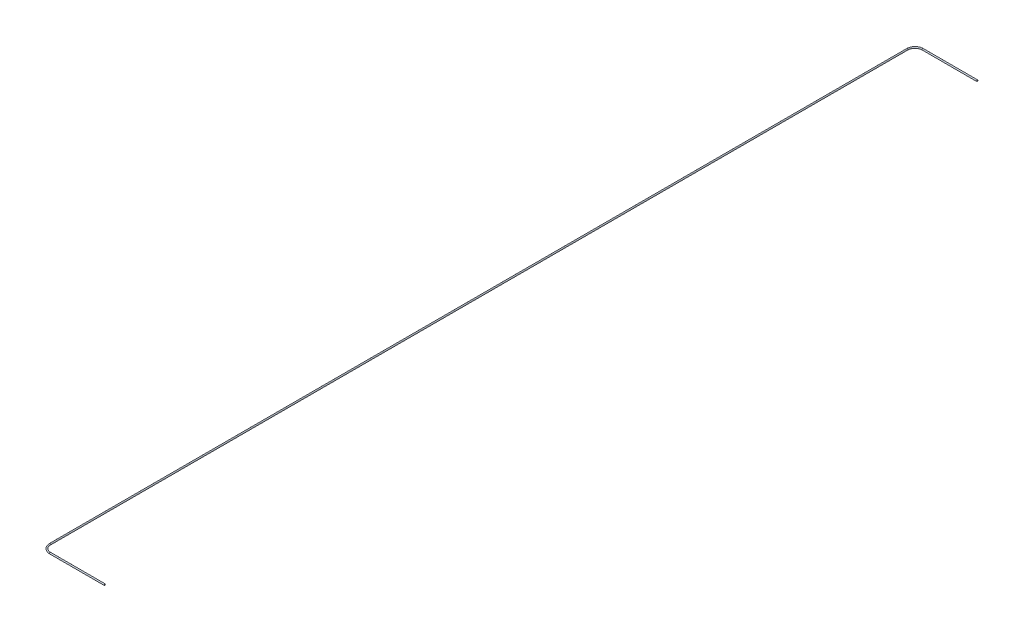
ISO-10303-21;
HEADER;
FILE_DESCRIPTION(('STEP AP214'),'2;1');
FILE_NAME('part.step','',(''),(''),'','','');
FILE_SCHEMA(('AUTOMOTIVE_DESIGN { 1 0 10303 214 1 1 1 1 }'));
ENDSEC;
DATA;
#1=APPLICATION_CONTEXT('core data for automotive mechanical design processes');
#2=APPLICATION_PROTOCOL_DEFINITION('international standard','automotive_design',2000,#1);
#3=PRODUCT_CONTEXT('',#1,'mechanical');
#4=PRODUCT('Part','Part','',(#3));
#5=PRODUCT_RELATED_PRODUCT_CATEGORY('part','',(#4));
#6=PRODUCT_DEFINITION_FORMATION('','',#4);
#7=PRODUCT_DEFINITION_CONTEXT('part definition',#1,'design');
#8=PRODUCT_DEFINITION('design','',#6,#7);
#9=PRODUCT_DEFINITION_SHAPE('','',#8);
#10=(LENGTH_UNIT() NAMED_UNIT(*) SI_UNIT(.MILLI.,.METRE.));
#11=(NAMED_UNIT(*) PLANE_ANGLE_UNIT() SI_UNIT($,.RADIAN.));
#12=(NAMED_UNIT(*) SI_UNIT($,.STERADIAN.) SOLID_ANGLE_UNIT());
#13=UNCERTAINTY_MEASURE_WITH_UNIT(LENGTH_MEASURE(1.E-05),#10,'distance_accuracy_value','');
#14=(GEOMETRIC_REPRESENTATION_CONTEXT(3) GLOBAL_UNCERTAINTY_ASSIGNED_CONTEXT((#13)) GLOBAL_UNIT_ASSIGNED_CONTEXT((#10,
#11,#12)) REPRESENTATION_CONTEXT('',''));
#15=CARTESIAN_POINT('',(0.,0.,0.));
#16=DIRECTION('',(0.,0.,1.));
#17=DIRECTION('',(1.,0.,0.));
#18=AXIS2_PLACEMENT_3D('',#15,#16,#17);
#19=CARTESIAN_POINT('',(599.999999999967,-1.87849735766576E-10,-4199.99999999948));
#20=DIRECTION('',(0.999999999999962,0.,0.));
#21=DIRECTION('',(0.,0.,-0.999999999999893));
#22=AXIS2_PLACEMENT_3D('',#19,#20,#21);
#23=PLANE('',#22);
#24=CARTESIAN_POINT('',(599.999999999967,-1.87849735766576E-10,-4199.99999999948));
#25=DIRECTION('',(0.999999999999962,0.,0.));
#26=DIRECTION('',(0.,0.,-0.999999999999893));
#27=AXIS2_PLACEMENT_3D('',#24,#25,#26);
#28=CIRCLE('',#27,6.3500000000003);
#29=CARTESIAN_POINT('',(599.999999999967,-1.88107410203919E-10,-4206.34999999948));
#30=VERTEX_POINT('',#29);
#31=EDGE_CURVE('E77',#30,#30,#28,.T.);
#32=ORIENTED_EDGE('',*,*,#31,.T.);
#33=EDGE_LOOP('',(#32));
#34=FACE_BOUND('',#33,.T.);
#35=ADVANCED_FACE('F48',(#34),#23,.T.);
#36=CARTESIAN_POINT('',(599.999999999932,1.97619698383278E-10,4199.99999999951));
#37=DIRECTION('',(-0.999999999999962,0.,0.));
#38=DIRECTION('',(0.,0.,0.999999999999893));
#39=AXIS2_PLACEMENT_3D('',#36,#37,#38);
#40=PLANE('',#39);
#41=CARTESIAN_POINT('',(599.999999999932,1.97619698383278E-10,4199.99999999951));
#42=DIRECTION('',(-0.999999999999962,0.,0.));
#43=DIRECTION('',(0.,0.,0.999999999999893));
#44=AXIS2_PLACEMENT_3D('',#41,#42,#43);
#45=CIRCLE('',#44,6.3500000000003);
#46=CARTESIAN_POINT('',(599.999999999932,1.97877372820621E-10,4206.3499999995));
#47=VERTEX_POINT('',#46);
#48=EDGE_CURVE('E11',#47,#47,#45,.T.);
#49=ORIENTED_EDGE('',*,*,#48,.F.);
#50=EDGE_LOOP('',(#49));
#51=FACE_BOUND('',#50,.T.);
#52=ADVANCED_FACE('F87',(#51),#40,.F.);
#53=CARTESIAN_POINT('',(599.999999999967,-1.87849735766576E-10,-4199.99999999948));
#54=DIRECTION('',(-0.999999999999962,0.,0.));
#55=DIRECTION('',(0.,0.,0.999999999999893));
#56=AXIS2_PLACEMENT_3D('',#53,#54,#55);
#57=CYLINDRICAL_SURFACE('',#56,6.3500000000003);
#58=CARTESIAN_POINT('',(74.9999999999851,-1.78523862359725E-10,-4199.99999999949));
#59=DIRECTION('',(0.999999999999962,0.,0.));
#60=DIRECTION('',(0.,0.,-0.999999999999893));
#61=AXIS2_PLACEMENT_3D('',#58,#59,#60);
#62=CIRCLE('',#61,6.3500000000003);
#63=CARTESIAN_POINT('',(74.9999999999859,-1.78711860125229E-10,-4206.34999999951));
#64=VERTEX_POINT('',#63);
#65=EDGE_CURVE('E73',#64,#64,#62,.T.);
#66=ORIENTED_EDGE('',*,*,#65,.T.);
#67=EDGE_LOOP('',(#66));
#68=FACE_BOUND('',#67,.T.);
#69=ORIENTED_EDGE('',*,*,#31,.F.);
#70=EDGE_LOOP('',(#69));
#71=FACE_BOUND('',#70,.T.);
#72=ADVANCED_FACE('F84',(#68,#71),#57,.T.);
#73=CARTESIAN_POINT('',(74.9999999999753,-1.76303416310475E-10,-4124.99999999951));
#74=DIRECTION('',(0.,1.00000000000002,0.));
#75=DIRECTION('',(0.,0.,0.999999999999893));
#76=AXIS2_PLACEMENT_3D('',#73,#74,#75);
#77=TOROIDAL_SURFACE('',#76,75.0000000000002,6.3500000000003);
#78=CARTESIAN_POINT('',(-1.86517468137026E-11,-1.73194791841524E-10,-4124.99999999951));
#79=DIRECTION('',(0.,0.,-0.999999999999893));
#80=DIRECTION('',(-0.999999999999962,0.,0.));
#81=AXIS2_PLACEMENT_3D('',#78,#79,#80);
#82=CIRCLE('',#81,6.3500000000003);
#83=CARTESIAN_POINT('',(-6.35000000002517,-1.7293159496982E-10,-4124.99999999951));
#84=VERTEX_POINT('',#83);
#85=EDGE_CURVE('E67',#84,#84,#82,.T.);
#86=CARTESIAN_POINT('',(74.9999999999753,-1.76303416310475E-10,-4124.99999999951));
#87=DIRECTION('',(0.,1.00000000000002,0.));
#88=DIRECTION('',(0.,0.,0.999999999999893));
#89=AXIS2_PLACEMENT_3D('',#86,#87,#88);
#90=CIRCLE('',#89,81.3500000000005);
#91=EDGE_CURVE('',#64,#84,#90,.T.);
#92=ORIENTED_EDGE('',*,*,#65,.F.);
#93=ORIENTED_EDGE('',*,*,#85,.T.);
#94=ORIENTED_EDGE('',*,*,#91,.T.);
#95=ORIENTED_EDGE('',*,*,#91,.F.);
#96=EDGE_LOOP('',(#92,#94,#93,#95));
#97=FACE_BOUND('',#96,.T.);
#98=ADVANCED_FACE('F86',(#97),#77,.T.);
#99=CARTESIAN_POINT('',(-1.86517468137026E-11,-1.73194791841524E-10,-4124.99999999951));
#100=DIRECTION('',(0.,0.,0.999999999999898));
#101=DIRECTION('',(0.99999999999994,0.,0.));
#102=AXIS2_PLACEMENT_3D('',#99,#100,#101);
#103=CYLINDRICAL_SURFACE('',#102,6.3500000000003);
#104=CARTESIAN_POINT('',(-3.81916720471054E-11,1.99840144432528E-10,4124.99999999952));
#105=DIRECTION('',(0.,0.,-0.999999999999898));
#106=DIRECTION('',(-0.99999999999994,0.,0.));
#107=AXIS2_PLACEMENT_3D('',#104,#105,#106);
#108=CIRCLE('',#107,6.3500000000003);
#109=CARTESIAN_POINT('',(-6.35000000002511,1.99689746220126E-10,4124.99999999952));
#110=VERTEX_POINT('',#109);
#111=EDGE_CURVE('E61',#110,#110,#108,.T.);
#112=ORIENTED_EDGE('',*,*,#111,.T.);
#113=EDGE_LOOP('',(#112));
#114=FACE_BOUND('',#113,.T.);
#115=ORIENTED_EDGE('',*,*,#85,.F.);
#116=EDGE_LOOP('',(#115));
#117=FACE_BOUND('',#116,.T.);
#118=ADVANCED_FACE('F94',(#114,#117),#103,.T.);
#119=CARTESIAN_POINT('',(74.9999999999762,2.01616501271928E-10,4124.9999999995));
#120=DIRECTION('',(0.,1.00000000000002,0.));
#121=DIRECTION('',(0.,0.,0.999999999999893));
#122=AXIS2_PLACEMENT_3D('',#119,#120,#121);
#123=TOROIDAL_SURFACE('',#122,75.000000000001,6.3500000000003);
#124=CARTESIAN_POINT('',(74.9999999999691,2.1049828546893E-10,4199.99999999951));
#125=DIRECTION('',(-0.999999999999962,0.,0.));
#126=DIRECTION('',(0.,0.,0.999999999999893));
#127=AXIS2_PLACEMENT_3D('',#124,#125,#126);
#128=CIRCLE('',#127,6.3500000000003);
#129=CARTESIAN_POINT('',(74.9999999999685,2.11250276530942E-10,4206.3499999995));
#130=VERTEX_POINT('',#129);
#131=EDGE_CURVE('E55',#130,#130,#128,.T.);
#132=CARTESIAN_POINT('',(74.9999999999762,2.01616501271928E-10,4124.9999999995));
#133=DIRECTION('',(0.,1.00000000000002,0.));
#134=DIRECTION('',(0.,0.,0.999999999999893));
#135=AXIS2_PLACEMENT_3D('',#132,#133,#134);
#136=CIRCLE('',#135,81.3500000000013);
#137=EDGE_CURVE('',#110,#130,#136,.T.);
#138=ORIENTED_EDGE('',*,*,#111,.F.);
#139=ORIENTED_EDGE('',*,*,#131,.T.);
#140=ORIENTED_EDGE('',*,*,#137,.T.);
#141=ORIENTED_EDGE('',*,*,#137,.F.);
#142=EDGE_LOOP('',(#138,#140,#139,#141));
#143=FACE_BOUND('',#142,.T.);
#144=ADVANCED_FACE('F100',(#143),#123,.T.);
#145=CARTESIAN_POINT('',(74.9999999999691,2.1049828546893E-10,4199.99999999951));
#146=DIRECTION('',(0.999999999999962,0.,0.));
#147=DIRECTION('',(0.,0.,-0.999999999999893));
#148=AXIS2_PLACEMENT_3D('',#145,#146,#147);
#149=CYLINDRICAL_SURFACE('',#148,6.3500000000003);
#150=ORIENTED_EDGE('',*,*,#48,.T.);
#151=EDGE_LOOP('',(#150));
#152=FACE_BOUND('',#151,.T.);
#153=ORIENTED_EDGE('',*,*,#131,.F.);
#154=EDGE_LOOP('',(#153));
#155=FACE_BOUND('',#154,.T.);
#156=ADVANCED_FACE('F98',(#152,#155),#149,.T.);
#157=CLOSED_SHELL('',(#35,#52,#72,#98,#118,#144,#156));
#158=MANIFOLD_SOLID_BREP('B2',#157);
#159=ADVANCED_BREP_SHAPE_REPRESENTATION('',(#18,#158),#14);
#160=SHAPE_DEFINITION_REPRESENTATION(#9,#159);
ENDSEC;
END-ISO-10303-21;
